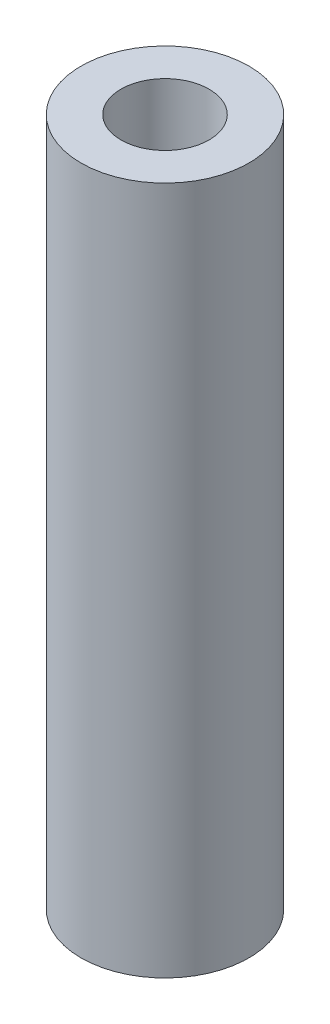
ISO-10303-21;
HEADER;
FILE_DESCRIPTION(('STEP AP214'),'2;1');
FILE_NAME('part.step','',(''),(''),'','','');
FILE_SCHEMA(('AUTOMOTIVE_DESIGN { 1 0 10303 214 1 1 1 1 }'));
ENDSEC;
DATA;
#1=APPLICATION_CONTEXT('core data for automotive mechanical design processes');
#2=APPLICATION_PROTOCOL_DEFINITION('international standard','automotive_design',2000,#1);
#3=PRODUCT_CONTEXT('',#1,'mechanical');
#4=PRODUCT('Part','Part','',(#3));
#5=PRODUCT_RELATED_PRODUCT_CATEGORY('part','',(#4));
#6=PRODUCT_DEFINITION_FORMATION('','',#4);
#7=PRODUCT_DEFINITION_CONTEXT('part definition',#1,'design');
#8=PRODUCT_DEFINITION('design','',#6,#7);
#9=PRODUCT_DEFINITION_SHAPE('','',#8);
#10=(LENGTH_UNIT() NAMED_UNIT(*) SI_UNIT(.MILLI.,.METRE.));
#11=(NAMED_UNIT(*) PLANE_ANGLE_UNIT() SI_UNIT($,.RADIAN.));
#12=(NAMED_UNIT(*) SI_UNIT($,.STERADIAN.) SOLID_ANGLE_UNIT());
#13=UNCERTAINTY_MEASURE_WITH_UNIT(LENGTH_MEASURE(1.E-05),#10,'distance_accuracy_value','');
#14=(GEOMETRIC_REPRESENTATION_CONTEXT(3) GLOBAL_UNCERTAINTY_ASSIGNED_CONTEXT((#13)) GLOBAL_UNIT_ASSIGNED_CONTEXT((#10,
#11,#12)) REPRESENTATION_CONTEXT('',''));
#15=CARTESIAN_POINT('',(0.,0.,0.));
#16=DIRECTION('',(0.,0.,1.));
#17=DIRECTION('',(1.,0.,0.));
#18=AXIS2_PLACEMENT_3D('',#15,#16,#17);
#19=CARTESIAN_POINT('',(0.,25.,0.));
#20=DIRECTION('',(0.,1.,0.));
#21=DIRECTION('',(0.,0.,1.));
#22=AXIS2_PLACEMENT_3D('',#19,#20,#21);
#23=PLANE('',#22);
#24=CARTESIAN_POINT('',(0.,25.,0.));
#25=DIRECTION('',(0.,1.,0.));
#26=DIRECTION('',(0.,0.,1.));
#27=AXIS2_PLACEMENT_3D('',#24,#25,#26);
#28=CIRCLE('',#27,3.05);
#29=CARTESIAN_POINT('',(0.,25.,3.05));
#30=VERTEX_POINT('',#29);
#31=EDGE_CURVE('E10',#30,#30,#28,.T.);
#32=ORIENTED_EDGE('',*,*,#31,.T.);
#33=EDGE_LOOP('',(#32));
#34=FACE_BOUND('',#33,.T.);
#35=CARTESIAN_POINT('',(0.,25.,0.));
#36=DIRECTION('',(0.,1.,0.));
#37=DIRECTION('',(0.,0.,1.));
#38=AXIS2_PLACEMENT_3D('',#35,#36,#37);
#39=CIRCLE('',#38,1.6);
#40=CARTESIAN_POINT('',(0.,25.,1.6));
#41=VERTEX_POINT('',#40);
#42=EDGE_CURVE('E44',#41,#41,#39,.T.);
#43=ORIENTED_EDGE('',*,*,#42,.F.);
#44=EDGE_LOOP('',(#43));
#45=FACE_BOUND('',#44,.T.);
#46=ADVANCED_FACE('F33',(#34,#45),#23,.T.);
#47=CARTESIAN_POINT('',(0.,0.,0.));
#48=DIRECTION('',(0.,1.,0.));
#49=DIRECTION('',(0.,0.,1.));
#50=AXIS2_PLACEMENT_3D('',#47,#48,#49);
#51=PLANE('',#50);
#52=CARTESIAN_POINT('',(0.,0.,0.));
#53=DIRECTION('',(0.,1.,0.));
#54=DIRECTION('',(0.,0.,1.));
#55=AXIS2_PLACEMENT_3D('',#52,#53,#54);
#56=CIRCLE('',#55,3.05);
#57=CARTESIAN_POINT('',(0.,0.,3.05));
#58=VERTEX_POINT('',#57);
#59=EDGE_CURVE('E37',#58,#58,#56,.T.);
#60=ORIENTED_EDGE('',*,*,#59,.F.);
#61=EDGE_LOOP('',(#60));
#62=FACE_BOUND('',#61,.T.);
#63=CARTESIAN_POINT('',(0.,0.,0.));
#64=DIRECTION('',(0.,1.,0.));
#65=DIRECTION('',(0.,0.,1.));
#66=AXIS2_PLACEMENT_3D('',#63,#64,#65);
#67=CIRCLE('',#66,1.6);
#68=CARTESIAN_POINT('',(0.,0.,1.6));
#69=VERTEX_POINT('',#68);
#70=EDGE_CURVE('E46',#69,#69,#67,.T.);
#71=ORIENTED_EDGE('',*,*,#70,.T.);
#72=EDGE_LOOP('',(#71));
#73=FACE_BOUND('',#72,.T.);
#74=ADVANCED_FACE('F56',(#62,#73),#51,.F.);
#75=CARTESIAN_POINT('',(0.,25.,0.));
#76=DIRECTION('',(0.,-1.,0.));
#77=DIRECTION('',(0.,0.,-1.));
#78=AXIS2_PLACEMENT_3D('',#75,#76,#77);
#79=CYLINDRICAL_SURFACE('',#78,3.05);
#80=ORIENTED_EDGE('',*,*,#31,.F.);
#81=EDGE_LOOP('',(#80));
#82=FACE_BOUND('',#81,.T.);
#83=ORIENTED_EDGE('',*,*,#59,.T.);
#84=EDGE_LOOP('',(#83));
#85=FACE_BOUND('',#84,.T.);
#86=ADVANCED_FACE('F35',(#82,#85),#79,.T.);
#87=CARTESIAN_POINT('',(0.,25.,0.));
#88=DIRECTION('',(0.,-1.,0.));
#89=DIRECTION('',(0.,0.,-1.));
#90=AXIS2_PLACEMENT_3D('',#87,#88,#89);
#91=CYLINDRICAL_SURFACE('',#90,1.6);
#92=ORIENTED_EDGE('',*,*,#42,.T.);
#93=EDGE_LOOP('',(#92));
#94=FACE_BOUND('',#93,.T.);
#95=ORIENTED_EDGE('',*,*,#70,.F.);
#96=EDGE_LOOP('',(#95));
#97=FACE_BOUND('',#96,.T.);
#98=ADVANCED_FACE('F52',(#94,#97),#91,.F.);
#99=CLOSED_SHELL('',(#46,#74,#86,#98));
#100=MANIFOLD_SOLID_BREP('B2',#99);
#101=ADVANCED_BREP_SHAPE_REPRESENTATION('',(#18,#100),#14);
#102=SHAPE_DEFINITION_REPRESENTATION(#9,#101);
ENDSEC;
END-ISO-10303-21;
